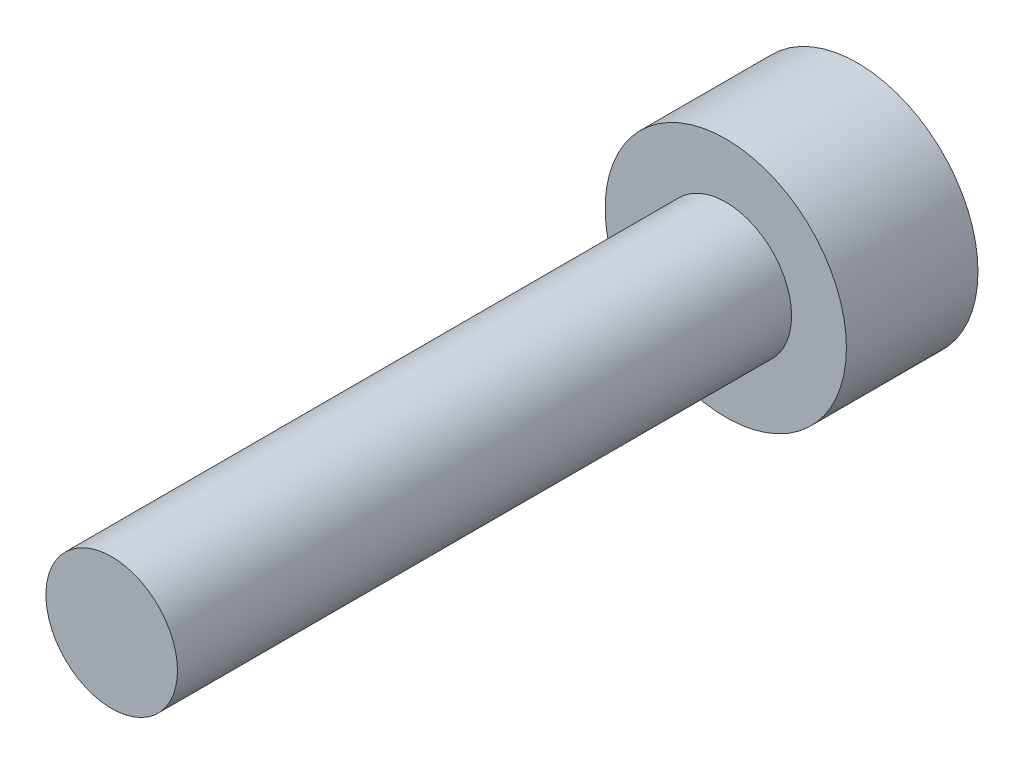
ISO-10303-21;
HEADER;
FILE_DESCRIPTION(('STEP AP214'),'2;1');
FILE_NAME('part.step','',(''),(''),'','','');
FILE_SCHEMA(('AUTOMOTIVE_DESIGN { 1 0 10303 214 1 1 1 1 }'));
ENDSEC;
DATA;
#1=APPLICATION_CONTEXT('core data for automotive mechanical design processes');
#2=APPLICATION_PROTOCOL_DEFINITION('international standard','automotive_design',2000,#1);
#3=PRODUCT_CONTEXT('',#1,'mechanical');
#4=PRODUCT('Part','Part','',(#3));
#5=PRODUCT_RELATED_PRODUCT_CATEGORY('part','',(#4));
#6=PRODUCT_DEFINITION_FORMATION('','',#4);
#7=PRODUCT_DEFINITION_CONTEXT('part definition',#1,'design');
#8=PRODUCT_DEFINITION('design','',#6,#7);
#9=PRODUCT_DEFINITION_SHAPE('','',#8);
#10=(LENGTH_UNIT() NAMED_UNIT(*) SI_UNIT(.MILLI.,.METRE.));
#11=(NAMED_UNIT(*) PLANE_ANGLE_UNIT() SI_UNIT($,.RADIAN.));
#12=(NAMED_UNIT(*) SI_UNIT($,.STERADIAN.) SOLID_ANGLE_UNIT());
#13=UNCERTAINTY_MEASURE_WITH_UNIT(LENGTH_MEASURE(1.E-05),#10,'distance_accuracy_value','');
#14=(GEOMETRIC_REPRESENTATION_CONTEXT(3) GLOBAL_UNCERTAINTY_ASSIGNED_CONTEXT((#13)) GLOBAL_UNIT_ASSIGNED_CONTEXT((#10,
#11,#12)) REPRESENTATION_CONTEXT('',''));
#15=CARTESIAN_POINT('',(0.,0.,0.));
#16=DIRECTION('',(0.,0.,1.));
#17=DIRECTION('',(1.,0.,0.));
#18=AXIS2_PLACEMENT_3D('',#15,#16,#17);
#19=CARTESIAN_POINT('',(0.,0.,-3.));
#20=DIRECTION('',(0.,0.,1.));
#21=DIRECTION('',(1.,0.,0.));
#22=AXIS2_PLACEMENT_3D('',#19,#20,#21);
#23=PLANE('',#22);
#24=CARTESIAN_POINT('',(0.,0.,-3.));
#25=DIRECTION('',(0.,0.,1.));
#26=DIRECTION('',(1.,0.,0.));
#27=AXIS2_PLACEMENT_3D('',#24,#25,#26);
#28=CIRCLE('',#27,2.75);
#29=CARTESIAN_POINT('',(2.75,0.,-3.));
#30=VERTEX_POINT('',#29);
#31=EDGE_CURVE('E50',#30,#30,#28,.T.);
#32=ORIENTED_EDGE('',*,*,#31,.F.);
#33=EDGE_LOOP('',(#32));
#34=FACE_BOUND('',#33,.T.);
#35=DIRECTION('',(0.866025403784441,-0.499999999999995,0.));
#36=VECTOR('',#35,1.);
#37=CARTESIAN_POINT('',(-1.24999999999999,-0.721687836487047,-3.));
#38=LINE('',#37,#36);
#39=CARTESIAN_POINT('',(-1.24999999999999,-0.721687836487047,-3.));
#40=VERTEX_POINT('',#39);
#41=CARTESIAN_POINT('',(0.,-1.44337567297406,-3.));
#42=VERTEX_POINT('',#41);
#43=EDGE_CURVE('E63',#40,#42,#38,.T.);
#44=ORIENTED_EDGE('',*,*,#43,.T.);
#45=DIRECTION('',(0.866025403784438,0.500000000000001,0.));
#46=VECTOR('',#45,1.);
#47=CARTESIAN_POINT('',(0.,-1.44337567297406,-3.));
#48=LINE('',#47,#46);
#49=CARTESIAN_POINT('',(1.25,-0.721687836487029,-3.));
#50=VERTEX_POINT('',#49);
#51=EDGE_CURVE('E137',#42,#50,#48,.T.);
#52=ORIENTED_EDGE('',*,*,#51,.T.);
#53=DIRECTION('',(0.,1.,0.));
#54=VECTOR('',#53,1.);
#55=CARTESIAN_POINT('',(1.25,-0.721687836487029,-3.));
#56=LINE('',#55,#54);
#57=CARTESIAN_POINT('',(1.25,0.721687836487038,-3.));
#58=VERTEX_POINT('',#57);
#59=EDGE_CURVE('E142',#50,#58,#56,.T.);
#60=ORIENTED_EDGE('',*,*,#59,.T.);
#61=DIRECTION('',(-0.866025403784442,0.499999999999995,0.));
#62=VECTOR('',#61,1.);
#63=CARTESIAN_POINT('',(1.25,0.721687836487038,-3.));
#64=LINE('',#63,#62);
#65=CARTESIAN_POINT('',(0.,1.44337567297406,-3.));
#66=VERTEX_POINT('',#65);
#67=EDGE_CURVE('E148',#58,#66,#64,.T.);
#68=ORIENTED_EDGE('',*,*,#67,.T.);
#69=DIRECTION('',(-0.866025403784434,-0.500000000000007,0.));
#70=VECTOR('',#69,1.);
#71=CARTESIAN_POINT('',(0.,1.44337567297406,-3.));
#72=LINE('',#71,#70);
#73=CARTESIAN_POINT('',(-1.25000000000001,0.721687836487021,-3.));
#74=VERTEX_POINT('',#73);
#75=EDGE_CURVE('E122',#66,#74,#72,.T.);
#76=ORIENTED_EDGE('',*,*,#75,.T.);
#77=DIRECTION('',(0.,-1.,0.));
#78=VECTOR('',#77,1.);
#79=CARTESIAN_POINT('',(-1.25000000000001,0.721687836487021,-3.));
#80=LINE('',#79,#78);
#81=EDGE_CURVE('E151',#74,#40,#80,.T.);
#82=ORIENTED_EDGE('',*,*,#81,.T.);
#83=EDGE_LOOP('',(#44,#52,#60,#68,#76,#82));
#84=FACE_BOUND('',#83,.T.);
#85=ADVANCED_FACE('F43',(#34,#84),#23,.F.);
#86=CARTESIAN_POINT('',(0.,0.,0.));
#87=DIRECTION('',(0.,0.,-1.));
#88=DIRECTION('',(-1.,0.,0.));
#89=AXIS2_PLACEMENT_3D('',#86,#87,#88);
#90=CYLINDRICAL_SURFACE('',#89,2.75);
#91=CARTESIAN_POINT('',(0.,0.,0.));
#92=DIRECTION('',(0.,0.,1.));
#93=DIRECTION('',(1.,0.,0.));
#94=AXIS2_PLACEMENT_3D('',#91,#92,#93);
#95=CIRCLE('',#94,2.75);
#96=CARTESIAN_POINT('',(2.75,0.,0.));
#97=VERTEX_POINT('',#96);
#98=EDGE_CURVE('E52',#97,#97,#95,.T.);
#99=ORIENTED_EDGE('',*,*,#98,.F.);
#100=EDGE_LOOP('',(#99));
#101=FACE_BOUND('',#100,.T.);
#102=ORIENTED_EDGE('',*,*,#31,.T.);
#103=EDGE_LOOP('',(#102));
#104=FACE_BOUND('',#103,.T.);
#105=ADVANCED_FACE('F44',(#101,#104),#90,.T.);
#106=CARTESIAN_POINT('',(0.,0.,0.));
#107=DIRECTION('',(0.,0.,1.));
#108=DIRECTION('',(1.,0.,0.));
#109=AXIS2_PLACEMENT_3D('',#106,#107,#108);
#110=PLANE('',#109);
#111=CARTESIAN_POINT('',(0.,0.,0.));
#112=DIRECTION('',(0.,0.,1.));
#113=DIRECTION('',(1.,0.,0.));
#114=AXIS2_PLACEMENT_3D('',#111,#112,#113);
#115=CIRCLE('',#114,1.5);
#116=CARTESIAN_POINT('',(1.5,0.,0.));
#117=VERTEX_POINT('',#116);
#118=EDGE_CURVE('E11',#117,#117,#115,.T.);
#119=ORIENTED_EDGE('',*,*,#118,.F.);
#120=EDGE_LOOP('',(#119));
#121=FACE_BOUND('',#120,.T.);
#122=ORIENTED_EDGE('',*,*,#98,.T.);
#123=EDGE_LOOP('',(#122));
#124=FACE_BOUND('',#123,.T.);
#125=ADVANCED_FACE('F211',(#121,#124),#110,.T.);
#126=CARTESIAN_POINT('',(0.,0.,14.));
#127=DIRECTION('',(0.,0.,-1.));
#128=DIRECTION('',(-1.,0.,0.));
#129=AXIS2_PLACEMENT_3D('',#126,#127,#128);
#130=CYLINDRICAL_SURFACE('',#129,1.5);
#131=CARTESIAN_POINT('',(0.,0.,14.));
#132=DIRECTION('',(0.,0.,1.));
#133=DIRECTION('',(1.,0.,0.));
#134=AXIS2_PLACEMENT_3D('',#131,#132,#133);
#135=CIRCLE('',#134,1.5);
#136=CARTESIAN_POINT('',(1.5,0.,14.));
#137=VERTEX_POINT('',#136);
#138=EDGE_CURVE('E170',#137,#137,#135,.T.);
#139=ORIENTED_EDGE('',*,*,#138,.F.);
#140=EDGE_LOOP('',(#139));
#141=FACE_BOUND('',#140,.T.);
#142=ORIENTED_EDGE('',*,*,#118,.T.);
#143=EDGE_LOOP('',(#142));
#144=FACE_BOUND('',#143,.T.);
#145=ADVANCED_FACE('F210',(#141,#144),#130,.T.);
#146=CARTESIAN_POINT('',(0.,0.,14.));
#147=DIRECTION('',(0.,0.,1.));
#148=DIRECTION('',(1.,0.,0.));
#149=AXIS2_PLACEMENT_3D('',#146,#147,#148);
#150=PLANE('',#149);
#151=ORIENTED_EDGE('',*,*,#138,.T.);
#152=EDGE_LOOP('',(#151));
#153=FACE_BOUND('',#152,.T.);
#154=ADVANCED_FACE('F203',(#153),#150,.T.);
#155=CARTESIAN_POINT('',(-1.24999999999999,-0.721687836487047,-1.5));
#156=DIRECTION('',(0.499999999999995,0.866025403784441,0.));
#157=DIRECTION('',(-0.866025403784442,0.499999999999995,0.));
#158=AXIS2_PLACEMENT_3D('',#155,#156,#157);
#159=PLANE('',#158);
#160=ORIENTED_EDGE('',*,*,#43,.F.);
#161=DIRECTION('',(0.,0.,-1.));
#162=VECTOR('',#161,1.);
#163=CARTESIAN_POINT('',(-1.24999999999999,-0.721687836487047,-1.5));
#164=LINE('',#163,#162);
#165=CARTESIAN_POINT('',(-1.24999999999999,-0.721687836487047,-1.5));
#166=VERTEX_POINT('',#165);
#167=EDGE_CURVE('E135',#166,#40,#164,.T.);
#168=ORIENTED_EDGE('',*,*,#167,.F.);
#169=DIRECTION('',(0.866025403784441,-0.499999999999995,0.));
#170=VECTOR('',#169,1.);
#171=CARTESIAN_POINT('',(-1.24999999999999,-0.721687836487047,-1.5));
#172=LINE('',#171,#170);
#173=CARTESIAN_POINT('',(0.,-1.44337567297406,-1.5));
#174=VERTEX_POINT('',#173);
#175=EDGE_CURVE('E154',#166,#174,#172,.T.);
#176=ORIENTED_EDGE('',*,*,#175,.T.);
#177=DIRECTION('',(0.,0.,-1.));
#178=VECTOR('',#177,1.);
#179=CARTESIAN_POINT('',(0.,-1.44337567297406,-1.5));
#180=LINE('',#179,#178);
#181=EDGE_CURVE('E163',#174,#42,#180,.T.);
#182=ORIENTED_EDGE('',*,*,#181,.T.);
#183=EDGE_LOOP('',(#160,#168,#176,#182));
#184=FACE_BOUND('',#183,.T.);
#185=ADVANCED_FACE('F181',(#184),#159,.T.);
#186=CARTESIAN_POINT('',(0.,-1.44337567297406,-1.5));
#187=DIRECTION('',(-0.500000000000001,0.866025403784438,0.));
#188=DIRECTION('',(-0.866025403784438,-0.500000000000001,0.));
#189=AXIS2_PLACEMENT_3D('',#186,#187,#188);
#190=PLANE('',#189);
#191=ORIENTED_EDGE('',*,*,#51,.F.);
#192=ORIENTED_EDGE('',*,*,#181,.F.);
#193=DIRECTION('',(0.866025403784438,0.500000000000001,0.));
#194=VECTOR('',#193,1.);
#195=CARTESIAN_POINT('',(0.,-1.44337567297406,-1.5));
#196=LINE('',#195,#194);
#197=CARTESIAN_POINT('',(1.25,-0.721687836487029,-1.5));
#198=VERTEX_POINT('',#197);
#199=EDGE_CURVE('E99',#174,#198,#196,.T.);
#200=ORIENTED_EDGE('',*,*,#199,.T.);
#201=DIRECTION('',(0.,0.,-1.));
#202=VECTOR('',#201,1.);
#203=CARTESIAN_POINT('',(1.25,-0.721687836487029,-1.5));
#204=LINE('',#203,#202);
#205=EDGE_CURVE('E161',#198,#50,#204,.T.);
#206=ORIENTED_EDGE('',*,*,#205,.T.);
#207=EDGE_LOOP('',(#191,#192,#200,#206));
#208=FACE_BOUND('',#207,.T.);
#209=ADVANCED_FACE('F193',(#208),#190,.T.);
#210=CARTESIAN_POINT('',(1.25,-0.721687836487029,-1.5));
#211=DIRECTION('',(-1.,0.,0.));
#212=DIRECTION('',(0.,-1.,0.));
#213=AXIS2_PLACEMENT_3D('',#210,#211,#212);
#214=PLANE('',#213);
#215=ORIENTED_EDGE('',*,*,#59,.F.);
#216=ORIENTED_EDGE('',*,*,#205,.F.);
#217=DIRECTION('',(0.,1.,0.));
#218=VECTOR('',#217,1.);
#219=CARTESIAN_POINT('',(1.25,-0.721687836487029,-1.5));
#220=LINE('',#219,#218);
#221=CARTESIAN_POINT('',(1.25,0.721687836487038,-1.5));
#222=VERTEX_POINT('',#221);
#223=EDGE_CURVE('E117',#198,#222,#220,.T.);
#224=ORIENTED_EDGE('',*,*,#223,.T.);
#225=DIRECTION('',(0.,0.,-1.));
#226=VECTOR('',#225,1.);
#227=CARTESIAN_POINT('',(1.25,0.721687836487038,-1.5));
#228=LINE('',#227,#226);
#229=EDGE_CURVE('E113',#222,#58,#228,.T.);
#230=ORIENTED_EDGE('',*,*,#229,.T.);
#231=EDGE_LOOP('',(#215,#216,#224,#230));
#232=FACE_BOUND('',#231,.T.);
#233=ADVANCED_FACE('F195',(#232),#214,.T.);
#234=CARTESIAN_POINT('',(1.25,0.721687836487038,-1.5));
#235=DIRECTION('',(-0.499999999999995,-0.866025403784441,0.));
#236=DIRECTION('',(0.866025403784442,-0.499999999999995,0.));
#237=AXIS2_PLACEMENT_3D('',#234,#235,#236);
#238=PLANE('',#237);
#239=ORIENTED_EDGE('',*,*,#67,.F.);
#240=ORIENTED_EDGE('',*,*,#229,.F.);
#241=DIRECTION('',(-0.866025403784442,0.499999999999995,0.));
#242=VECTOR('',#241,1.);
#243=CARTESIAN_POINT('',(1.25,0.721687836487038,-1.5));
#244=LINE('',#243,#242);
#245=CARTESIAN_POINT('',(0.,1.44337567297406,-1.5));
#246=VERTEX_POINT('',#245);
#247=EDGE_CURVE('E109',#222,#246,#244,.T.);
#248=ORIENTED_EDGE('',*,*,#247,.T.);
#249=DIRECTION('',(0.,0.,-1.));
#250=VECTOR('',#249,1.);
#251=CARTESIAN_POINT('',(0.,1.44337567297406,-1.5));
#252=LINE('',#251,#250);
#253=EDGE_CURVE('E111',#246,#66,#252,.T.);
#254=ORIENTED_EDGE('',*,*,#253,.T.);
#255=EDGE_LOOP('',(#239,#240,#248,#254));
#256=FACE_BOUND('',#255,.T.);
#257=ADVANCED_FACE('F114',(#256),#238,.T.);
#258=CARTESIAN_POINT('',(0.,1.44337567297406,-1.5));
#259=DIRECTION('',(0.500000000000007,-0.866025403784435,0.));
#260=DIRECTION('',(0.866025403784434,0.500000000000007,0.));
#261=AXIS2_PLACEMENT_3D('',#258,#259,#260);
#262=PLANE('',#261);
#263=ORIENTED_EDGE('',*,*,#75,.F.);
#264=ORIENTED_EDGE('',*,*,#253,.F.);
#265=DIRECTION('',(-0.866025403784434,-0.500000000000007,0.));
#266=VECTOR('',#265,1.);
#267=CARTESIAN_POINT('',(0.,1.44337567297406,-1.5));
#268=LINE('',#267,#266);
#269=CARTESIAN_POINT('',(-1.25000000000001,0.721687836487021,-1.5));
#270=VERTEX_POINT('',#269);
#271=EDGE_CURVE('E116',#246,#270,#268,.T.);
#272=ORIENTED_EDGE('',*,*,#271,.T.);
#273=DIRECTION('',(0.,0.,-1.));
#274=VECTOR('',#273,1.);
#275=CARTESIAN_POINT('',(-1.25000000000001,0.721687836487021,-1.5));
#276=LINE('',#275,#274);
#277=EDGE_CURVE('E93',#270,#74,#276,.T.);
#278=ORIENTED_EDGE('',*,*,#277,.T.);
#279=EDGE_LOOP('',(#263,#264,#272,#278));
#280=FACE_BOUND('',#279,.T.);
#281=ADVANCED_FACE('F121',(#280),#262,.T.);
#282=CARTESIAN_POINT('',(-1.25000000000001,0.721687836487021,-1.5));
#283=DIRECTION('',(1.,0.,0.));
#284=DIRECTION('',(0.,1.,0.));
#285=AXIS2_PLACEMENT_3D('',#282,#283,#284);
#286=PLANE('',#285);
#287=ORIENTED_EDGE('',*,*,#81,.F.);
#288=ORIENTED_EDGE('',*,*,#277,.F.);
#289=DIRECTION('',(0.,-1.,0.));
#290=VECTOR('',#289,1.);
#291=CARTESIAN_POINT('',(-1.25000000000001,0.721687836487021,-1.5));
#292=LINE('',#291,#290);
#293=EDGE_CURVE('E68',#270,#166,#292,.T.);
#294=ORIENTED_EDGE('',*,*,#293,.T.);
#295=ORIENTED_EDGE('',*,*,#167,.T.);
#296=EDGE_LOOP('',(#287,#288,#294,#295));
#297=FACE_BOUND('',#296,.T.);
#298=ADVANCED_FACE('F185',(#297),#286,.T.);
#299=CARTESIAN_POINT('',(0.,0.,-1.5));
#300=DIRECTION('',(0.,0.,1.));
#301=DIRECTION('',(1.,0.,0.));
#302=AXIS2_PLACEMENT_3D('',#299,#300,#301);
#303=PLANE('',#302);
#304=ORIENTED_EDGE('',*,*,#175,.F.);
#305=ORIENTED_EDGE('',*,*,#293,.F.);
#306=ORIENTED_EDGE('',*,*,#271,.F.);
#307=ORIENTED_EDGE('',*,*,#247,.F.);
#308=ORIENTED_EDGE('',*,*,#223,.F.);
#309=ORIENTED_EDGE('',*,*,#199,.F.);
#310=EDGE_LOOP('',(#304,#305,#306,#307,#308,#309));
#311=FACE_BOUND('',#310,.T.);
#312=ADVANCED_FACE('F130',(#311),#303,.F.);
#313=CLOSED_SHELL('',(#85,#105,#125,#145,#154,#185,#209,#233,#257,#281,#298,#312));
#314=MANIFOLD_SOLID_BREP('B2',#313);
#315=ADVANCED_BREP_SHAPE_REPRESENTATION('',(#18,#314),#14);
#316=SHAPE_DEFINITION_REPRESENTATION(#9,#315);
ENDSEC;
END-ISO-10303-21;
